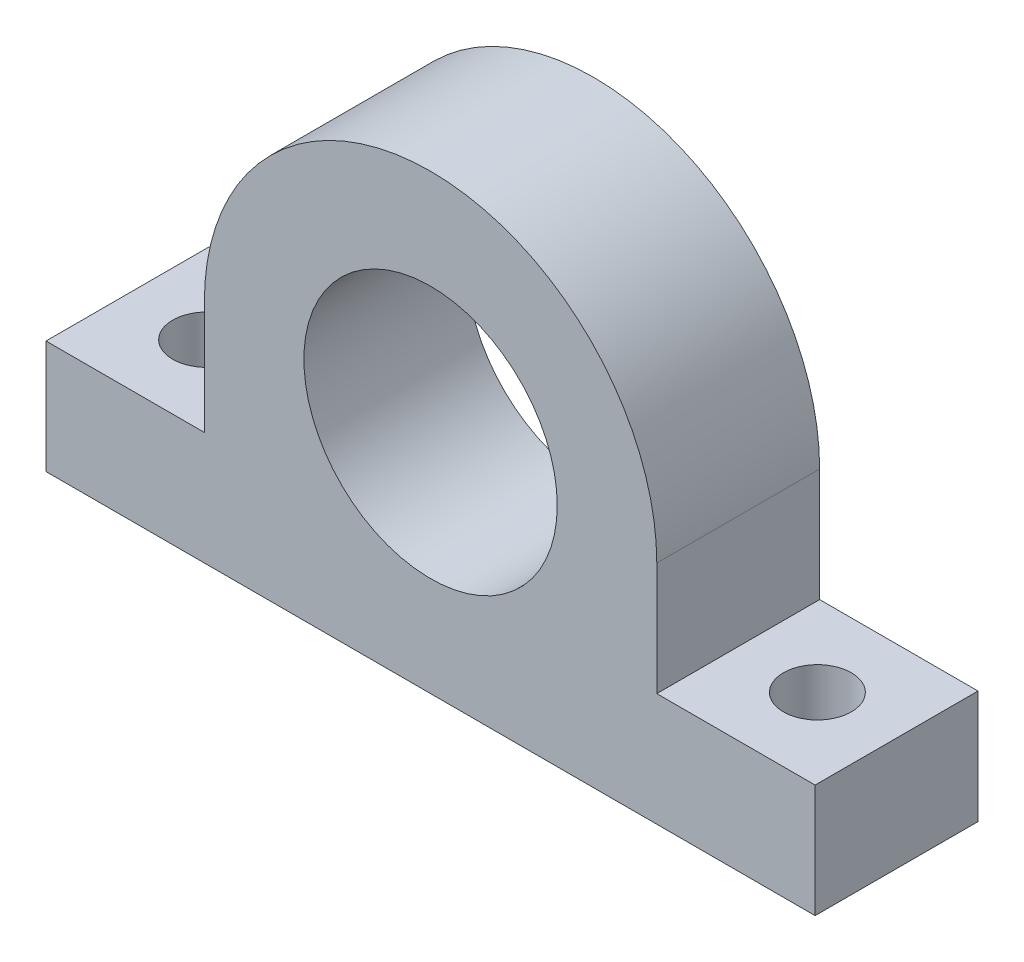
ISO-10303-21;
HEADER;
FILE_DESCRIPTION(('STEP AP214'),'2;1');
FILE_NAME('part.step','',(''),(''),'','','');
FILE_SCHEMA(('AUTOMOTIVE_DESIGN { 1 0 10303 214 1 1 1 1 }'));
ENDSEC;
DATA;
#1=APPLICATION_CONTEXT('core data for automotive mechanical design processes');
#2=APPLICATION_PROTOCOL_DEFINITION('international standard','automotive_design',2000,#1);
#3=PRODUCT_CONTEXT('',#1,'mechanical');
#4=PRODUCT('Part','Part','',(#3));
#5=PRODUCT_RELATED_PRODUCT_CATEGORY('part','',(#4));
#6=PRODUCT_DEFINITION_FORMATION('','',#4);
#7=PRODUCT_DEFINITION_CONTEXT('part definition',#1,'design');
#8=PRODUCT_DEFINITION('design','',#6,#7);
#9=PRODUCT_DEFINITION_SHAPE('','',#8);
#10=(LENGTH_UNIT() NAMED_UNIT(*) SI_UNIT(.MILLI.,.METRE.));
#11=(NAMED_UNIT(*) PLANE_ANGLE_UNIT() SI_UNIT($,.RADIAN.));
#12=(NAMED_UNIT(*) SI_UNIT($,.STERADIAN.) SOLID_ANGLE_UNIT());
#13=UNCERTAINTY_MEASURE_WITH_UNIT(LENGTH_MEASURE(1.E-05),#10,'distance_accuracy_value','');
#14=(GEOMETRIC_REPRESENTATION_CONTEXT(3) GLOBAL_UNCERTAINTY_ASSIGNED_CONTEXT((#13)) GLOBAL_UNIT_ASSIGNED_CONTEXT((#10,
#11,#12)) REPRESENTATION_CONTEXT('',''));
#15=CARTESIAN_POINT('',(0.,0.,0.));
#16=DIRECTION('',(0.,0.,1.));
#17=DIRECTION('',(1.,0.,0.));
#18=AXIS2_PLACEMENT_3D('',#15,#16,#17);
#19=CARTESIAN_POINT('',(0.,5.,7.2));
#20=DIRECTION('',(0.,0.,-1.));
#21=DIRECTION('',(-1.,0.,0.));
#22=AXIS2_PLACEMENT_3D('',#19,#20,#21);
#23=PLANE('',#22);
#24=DIRECTION('',(0.,1.,0.));
#25=VECTOR('',#24,1.);
#26=CARTESIAN_POINT('',(10.,5.,7.2));
#27=LINE('',#26,#25);
#28=CARTESIAN_POINT('',(10.,0.,7.2));
#29=VERTEX_POINT('',#28);
#30=CARTESIAN_POINT('',(10.,5.,7.2));
#31=VERTEX_POINT('',#30);
#32=EDGE_CURVE('E150',#29,#31,#27,.T.);
#33=ORIENTED_EDGE('',*,*,#32,.T.);
#34=CARTESIAN_POINT('',(0.,5.,7.2));
#35=DIRECTION('',(0.,0.,1.));
#36=DIRECTION('',(-1.,0.,0.));
#37=AXIS2_PLACEMENT_3D('',#34,#35,#36);
#38=CIRCLE('',#37,10.);
#39=CARTESIAN_POINT('',(-10.,5.,7.2));
#40=VERTEX_POINT('',#39);
#41=EDGE_CURVE('E98',#31,#40,#38,.T.);
#42=ORIENTED_EDGE('',*,*,#41,.T.);
#43=DIRECTION('',(0.,-1.,0.));
#44=VECTOR('',#43,1.);
#45=CARTESIAN_POINT('',(-10.,0.,7.2));
#46=LINE('',#45,#44);
#47=CARTESIAN_POINT('',(-10.,0.,7.2));
#48=VERTEX_POINT('',#47);
#49=EDGE_CURVE('E165',#40,#48,#46,.T.);
#50=ORIENTED_EDGE('',*,*,#49,.T.);
#51=DIRECTION('',(-1.,0.,0.));
#52=VECTOR('',#51,1.);
#53=CARTESIAN_POINT('',(-17.,0.,7.2));
#54=LINE('',#53,#52);
#55=CARTESIAN_POINT('',(-17.,0.,7.2));
#56=VERTEX_POINT('',#55);
#57=EDGE_CURVE('E178',#48,#56,#54,.T.);
#58=ORIENTED_EDGE('',*,*,#57,.T.);
#59=DIRECTION('',(0.,-1.,0.));
#60=VECTOR('',#59,1.);
#61=CARTESIAN_POINT('',(-17.,-5.,7.2));
#62=LINE('',#61,#60);
#63=CARTESIAN_POINT('',(-17.,-5.,7.2));
#64=VERTEX_POINT('',#63);
#65=EDGE_CURVE('E117',#56,#64,#62,.T.);
#66=ORIENTED_EDGE('',*,*,#65,.T.);
#67=DIRECTION('',(1.,0.,0.));
#68=VECTOR('',#67,1.);
#69=CARTESIAN_POINT('',(17.,-5.,7.2));
#70=LINE('',#69,#68);
#71=CARTESIAN_POINT('',(17.,-5.,7.2));
#72=VERTEX_POINT('',#71);
#73=EDGE_CURVE('E111',#64,#72,#70,.T.);
#74=ORIENTED_EDGE('',*,*,#73,.T.);
#75=DIRECTION('',(0.,1.,0.));
#76=VECTOR('',#75,1.);
#77=CARTESIAN_POINT('',(17.,0.,7.2));
#78=LINE('',#77,#76);
#79=CARTESIAN_POINT('',(17.,0.,7.2));
#80=VERTEX_POINT('',#79);
#81=EDGE_CURVE('E115',#72,#80,#78,.T.);
#82=ORIENTED_EDGE('',*,*,#81,.T.);
#83=DIRECTION('',(-1.,0.,0.));
#84=VECTOR('',#83,1.);
#85=CARTESIAN_POINT('',(10.,0.,7.2));
#86=LINE('',#85,#84);
#87=EDGE_CURVE('E55',#80,#29,#86,.T.);
#88=ORIENTED_EDGE('',*,*,#87,.T.);
#89=EDGE_LOOP('',(#33,#42,#50,#58,#66,#74,#82,#88));
#90=FACE_BOUND('',#89,.T.);
#91=CARTESIAN_POINT('',(0.,5.,7.2));
#92=DIRECTION('',(0.,0.,1.));
#93=DIRECTION('',(1.,0.,0.));
#94=AXIS2_PLACEMENT_3D('',#91,#92,#93);
#95=CIRCLE('',#94,5.6);
#96=CARTESIAN_POINT('',(5.6,5.,7.2));
#97=VERTEX_POINT('',#96);
#98=EDGE_CURVE('E139',#97,#97,#95,.T.);
#99=ORIENTED_EDGE('',*,*,#98,.F.);
#100=EDGE_LOOP('',(#99));
#101=FACE_BOUND('',#100,.T.);
#102=ADVANCED_FACE('F38',(#90,#101),#23,.F.);
#103=CARTESIAN_POINT('',(0.,5.,0.));
#104=DIRECTION('',(0.,0.,-1.));
#105=DIRECTION('',(-1.,0.,0.));
#106=AXIS2_PLACEMENT_3D('',#103,#104,#105);
#107=PLANE('',#106);
#108=DIRECTION('',(0.,1.,0.));
#109=VECTOR('',#108,1.);
#110=CARTESIAN_POINT('',(10.,5.,0.));
#111=LINE('',#110,#109);
#112=CARTESIAN_POINT('',(10.,0.,0.));
#113=VERTEX_POINT('',#112);
#114=CARTESIAN_POINT('',(10.,5.,0.));
#115=VERTEX_POINT('',#114);
#116=EDGE_CURVE('E135',#113,#115,#111,.T.);
#117=ORIENTED_EDGE('',*,*,#116,.F.);
#118=DIRECTION('',(-1.,0.,0.));
#119=VECTOR('',#118,1.);
#120=CARTESIAN_POINT('',(10.,0.,0.));
#121=LINE('',#120,#119);
#122=CARTESIAN_POINT('',(17.,0.,0.));
#123=VERTEX_POINT('',#122);
#124=EDGE_CURVE('E90',#123,#113,#121,.T.);
#125=ORIENTED_EDGE('',*,*,#124,.F.);
#126=DIRECTION('',(0.,1.,0.));
#127=VECTOR('',#126,1.);
#128=CARTESIAN_POINT('',(17.,0.,0.));
#129=LINE('',#128,#127);
#130=CARTESIAN_POINT('',(17.,-5.,0.));
#131=VERTEX_POINT('',#130);
#132=EDGE_CURVE('E84',#131,#123,#129,.T.);
#133=ORIENTED_EDGE('',*,*,#132,.F.);
#134=DIRECTION('',(1.,0.,0.));
#135=VECTOR('',#134,1.);
#136=CARTESIAN_POINT('',(17.,-5.,0.));
#137=LINE('',#136,#135);
#138=CARTESIAN_POINT('',(-17.,-5.,0.));
#139=VERTEX_POINT('',#138);
#140=EDGE_CURVE('E125',#139,#131,#137,.T.);
#141=ORIENTED_EDGE('',*,*,#140,.F.);
#142=DIRECTION('',(0.,-1.,0.));
#143=VECTOR('',#142,1.);
#144=CARTESIAN_POINT('',(-17.,-5.,0.));
#145=LINE('',#144,#143);
#146=CARTESIAN_POINT('',(-17.,0.,0.));
#147=VERTEX_POINT('',#146);
#148=EDGE_CURVE('E145',#147,#139,#145,.T.);
#149=ORIENTED_EDGE('',*,*,#148,.F.);
#150=DIRECTION('',(-1.,0.,0.));
#151=VECTOR('',#150,1.);
#152=CARTESIAN_POINT('',(-17.,0.,0.));
#153=LINE('',#152,#151);
#154=CARTESIAN_POINT('',(-10.,0.,0.));
#155=VERTEX_POINT('',#154);
#156=EDGE_CURVE('E143',#155,#147,#153,.T.);
#157=ORIENTED_EDGE('',*,*,#156,.F.);
#158=DIRECTION('',(0.,-1.,0.));
#159=VECTOR('',#158,1.);
#160=CARTESIAN_POINT('',(-10.,0.,0.));
#161=LINE('',#160,#159);
#162=CARTESIAN_POINT('',(-10.,5.,0.));
#163=VERTEX_POINT('',#162);
#164=EDGE_CURVE('E141',#163,#155,#161,.T.);
#165=ORIENTED_EDGE('',*,*,#164,.F.);
#166=CARTESIAN_POINT('',(0.,5.,0.));
#167=DIRECTION('',(0.,0.,1.));
#168=DIRECTION('',(-1.,0.,0.));
#169=AXIS2_PLACEMENT_3D('',#166,#167,#168);
#170=CIRCLE('',#169,10.);
#171=EDGE_CURVE('E138',#115,#163,#170,.T.);
#172=ORIENTED_EDGE('',*,*,#171,.F.);
#173=EDGE_LOOP('',(#117,#125,#133,#141,#149,#157,#165,#172));
#174=FACE_BOUND('',#173,.T.);
#175=CARTESIAN_POINT('',(0.,5.,0.));
#176=DIRECTION('',(0.,0.,1.));
#177=DIRECTION('',(1.,0.,0.));
#178=AXIS2_PLACEMENT_3D('',#175,#176,#177);
#179=CIRCLE('',#178,5.6);
#180=CARTESIAN_POINT('',(5.6,5.,0.));
#181=VERTEX_POINT('',#180);
#182=EDGE_CURVE('E184',#181,#181,#179,.T.);
#183=ORIENTED_EDGE('',*,*,#182,.T.);
#184=EDGE_LOOP('',(#183));
#185=FACE_BOUND('',#184,.T.);
#186=ADVANCED_FACE('F169',(#174,#185),#107,.T.);
#187=CARTESIAN_POINT('',(10.,5.,7.2));
#188=DIRECTION('',(-1.,0.,0.));
#189=DIRECTION('',(0.,-1.,0.));
#190=AXIS2_PLACEMENT_3D('',#187,#188,#189);
#191=PLANE('',#190);
#192=ORIENTED_EDGE('',*,*,#116,.T.);
#193=DIRECTION('',(0.,0.,-1.));
#194=VECTOR('',#193,1.);
#195=CARTESIAN_POINT('',(10.,5.,7.2));
#196=LINE('',#195,#194);
#197=EDGE_CURVE('E11',#31,#115,#196,.T.);
#198=ORIENTED_EDGE('',*,*,#197,.F.);
#199=ORIENTED_EDGE('',*,*,#32,.F.);
#200=DIRECTION('',(0.,0.,-1.));
#201=VECTOR('',#200,1.);
#202=CARTESIAN_POINT('',(10.,0.,7.2));
#203=LINE('',#202,#201);
#204=EDGE_CURVE('E131',#29,#113,#203,.T.);
#205=ORIENTED_EDGE('',*,*,#204,.T.);
#206=EDGE_LOOP('',(#192,#198,#199,#205));
#207=FACE_BOUND('',#206,.T.);
#208=ADVANCED_FACE('F40',(#207),#191,.F.);
#209=CARTESIAN_POINT('',(0.,5.,7.2));
#210=DIRECTION('',(0.,0.,-1.));
#211=DIRECTION('',(-1.,0.,0.));
#212=AXIS2_PLACEMENT_3D('',#209,#210,#211);
#213=CYLINDRICAL_SURFACE('',#212,10.);
#214=ORIENTED_EDGE('',*,*,#171,.T.);
#215=DIRECTION('',(0.,0.,-1.));
#216=VECTOR('',#215,1.);
#217=CARTESIAN_POINT('',(-10.,5.,7.2));
#218=LINE('',#217,#216);
#219=EDGE_CURVE('E47',#40,#163,#218,.T.);
#220=ORIENTED_EDGE('',*,*,#219,.F.);
#221=ORIENTED_EDGE('',*,*,#41,.F.);
#222=ORIENTED_EDGE('',*,*,#197,.T.);
#223=EDGE_LOOP('',(#214,#220,#221,#222));
#224=FACE_BOUND('',#223,.T.);
#225=ADVANCED_FACE('F244',(#224),#213,.T.);
#226=CARTESIAN_POINT('',(-10.,0.,7.2));
#227=DIRECTION('',(1.,0.,0.));
#228=DIRECTION('',(0.,0.,-1.));
#229=AXIS2_PLACEMENT_3D('',#226,#227,#228);
#230=PLANE('',#229);
#231=ORIENTED_EDGE('',*,*,#164,.T.);
#232=DIRECTION('',(0.,0.,-1.));
#233=VECTOR('',#232,1.);
#234=CARTESIAN_POINT('',(-10.,0.,7.2));
#235=LINE('',#234,#233);
#236=EDGE_CURVE('E157',#48,#155,#235,.T.);
#237=ORIENTED_EDGE('',*,*,#236,.F.);
#238=ORIENTED_EDGE('',*,*,#49,.F.);
#239=ORIENTED_EDGE('',*,*,#219,.T.);
#240=EDGE_LOOP('',(#231,#237,#238,#239));
#241=FACE_BOUND('',#240,.T.);
#242=ADVANCED_FACE('F163',(#241),#230,.F.);
#243=CARTESIAN_POINT('',(-17.,0.,7.2));
#244=DIRECTION('',(0.,-1.,0.));
#245=DIRECTION('',(1.,0.,0.));
#246=AXIS2_PLACEMENT_3D('',#243,#244,#245);
#247=PLANE('',#246);
#248=CARTESIAN_POINT('',(-13.5,0.,3.6));
#249=DIRECTION('',(0.,1.,0.));
#250=DIRECTION('',(1.,0.,0.));
#251=AXIS2_PLACEMENT_3D('',#248,#249,#250);
#252=CIRCLE('',#251,1.5);
#253=CARTESIAN_POINT('',(-12.,0.,3.6));
#254=VERTEX_POINT('',#253);
#255=EDGE_CURVE('E193',#254,#254,#252,.T.);
#256=ORIENTED_EDGE('',*,*,#255,.F.);
#257=EDGE_LOOP('',(#256));
#258=FACE_BOUND('',#257,.T.);
#259=ORIENTED_EDGE('',*,*,#156,.T.);
#260=DIRECTION('',(0.,0.,-1.));
#261=VECTOR('',#260,1.);
#262=CARTESIAN_POINT('',(-17.,0.,7.2));
#263=LINE('',#262,#261);
#264=EDGE_CURVE('E154',#56,#147,#263,.T.);
#265=ORIENTED_EDGE('',*,*,#264,.F.);
#266=ORIENTED_EDGE('',*,*,#57,.F.);
#267=ORIENTED_EDGE('',*,*,#236,.T.);
#268=EDGE_LOOP('',(#259,#265,#266,#267));
#269=FACE_BOUND('',#268,.T.);
#270=ADVANCED_FACE('F174',(#258,#269),#247,.F.);
#271=CARTESIAN_POINT('',(-17.,-5.,7.2));
#272=DIRECTION('',(1.,0.,0.));
#273=DIRECTION('',(0.,1.,0.));
#274=AXIS2_PLACEMENT_3D('',#271,#272,#273);
#275=PLANE('',#274);
#276=ORIENTED_EDGE('',*,*,#148,.T.);
#277=DIRECTION('',(0.,0.,-1.));
#278=VECTOR('',#277,1.);
#279=CARTESIAN_POINT('',(-17.,-5.,7.2));
#280=LINE('',#279,#278);
#281=EDGE_CURVE('E126',#64,#139,#280,.T.);
#282=ORIENTED_EDGE('',*,*,#281,.F.);
#283=ORIENTED_EDGE('',*,*,#65,.F.);
#284=ORIENTED_EDGE('',*,*,#264,.T.);
#285=EDGE_LOOP('',(#276,#282,#283,#284));
#286=FACE_BOUND('',#285,.T.);
#287=ADVANCED_FACE('F177',(#286),#275,.F.);
#288=CARTESIAN_POINT('',(17.,-5.,7.2));
#289=DIRECTION('',(0.,1.,0.));
#290=DIRECTION('',(-1.,0.,0.));
#291=AXIS2_PLACEMENT_3D('',#288,#289,#290);
#292=PLANE('',#291);
#293=CARTESIAN_POINT('',(13.5,-5.00000000000001,3.6));
#294=DIRECTION('',(0.,1.,0.));
#295=DIRECTION('',(-1.,0.,0.));
#296=AXIS2_PLACEMENT_3D('',#293,#294,#295);
#297=CIRCLE('',#296,1.5);
#298=CARTESIAN_POINT('',(12.,-5.00000000000001,3.6));
#299=VERTEX_POINT('',#298);
#300=EDGE_CURVE('E187',#299,#299,#297,.T.);
#301=ORIENTED_EDGE('',*,*,#300,.T.);
#302=EDGE_LOOP('',(#301));
#303=FACE_BOUND('',#302,.T.);
#304=CARTESIAN_POINT('',(-13.5,-5.00000000000001,3.6));
#305=DIRECTION('',(0.,1.,0.));
#306=DIRECTION('',(1.,0.,0.));
#307=AXIS2_PLACEMENT_3D('',#304,#305,#306);
#308=CIRCLE('',#307,1.5);
#309=CARTESIAN_POINT('',(-12.,-5.00000000000001,3.6));
#310=VERTEX_POINT('',#309);
#311=EDGE_CURVE('E190',#310,#310,#308,.T.);
#312=ORIENTED_EDGE('',*,*,#311,.T.);
#313=EDGE_LOOP('',(#312));
#314=FACE_BOUND('',#313,.T.);
#315=ORIENTED_EDGE('',*,*,#140,.T.);
#316=DIRECTION('',(0.,0.,-1.));
#317=VECTOR('',#316,1.);
#318=CARTESIAN_POINT('',(17.,-5.,7.2));
#319=LINE('',#318,#317);
#320=EDGE_CURVE('E122',#72,#131,#319,.T.);
#321=ORIENTED_EDGE('',*,*,#320,.F.);
#322=ORIENTED_EDGE('',*,*,#73,.F.);
#323=ORIENTED_EDGE('',*,*,#281,.T.);
#324=EDGE_LOOP('',(#315,#321,#322,#323));
#325=FACE_BOUND('',#324,.T.);
#326=ADVANCED_FACE('F123',(#303,#314,#325),#292,.F.);
#327=CARTESIAN_POINT('',(17.,0.,7.2));
#328=DIRECTION('',(-1.,0.,0.));
#329=DIRECTION('',(0.,0.,1.));
#330=AXIS2_PLACEMENT_3D('',#327,#328,#329);
#331=PLANE('',#330);
#332=ORIENTED_EDGE('',*,*,#132,.T.);
#333=DIRECTION('',(0.,0.,-1.));
#334=VECTOR('',#333,1.);
#335=CARTESIAN_POINT('',(17.,0.,7.2));
#336=LINE('',#335,#334);
#337=EDGE_CURVE('E127',#80,#123,#336,.T.);
#338=ORIENTED_EDGE('',*,*,#337,.F.);
#339=ORIENTED_EDGE('',*,*,#81,.F.);
#340=ORIENTED_EDGE('',*,*,#320,.T.);
#341=EDGE_LOOP('',(#332,#338,#339,#340));
#342=FACE_BOUND('',#341,.T.);
#343=ADVANCED_FACE('F129',(#342),#331,.F.);
#344=CARTESIAN_POINT('',(10.,0.,7.2));
#345=DIRECTION('',(0.,-1.,0.));
#346=DIRECTION('',(1.,0.,0.));
#347=AXIS2_PLACEMENT_3D('',#344,#345,#346);
#348=PLANE('',#347);
#349=CARTESIAN_POINT('',(13.5,0.,3.6));
#350=DIRECTION('',(0.,1.,0.));
#351=DIRECTION('',(-1.,0.,0.));
#352=AXIS2_PLACEMENT_3D('',#349,#350,#351);
#353=CIRCLE('',#352,1.5);
#354=CARTESIAN_POINT('',(12.,0.,3.6));
#355=VERTEX_POINT('',#354);
#356=EDGE_CURVE('E196',#355,#355,#353,.T.);
#357=ORIENTED_EDGE('',*,*,#356,.F.);
#358=EDGE_LOOP('',(#357));
#359=FACE_BOUND('',#358,.T.);
#360=ORIENTED_EDGE('',*,*,#124,.T.);
#361=ORIENTED_EDGE('',*,*,#204,.F.);
#362=ORIENTED_EDGE('',*,*,#87,.F.);
#363=ORIENTED_EDGE('',*,*,#337,.T.);
#364=EDGE_LOOP('',(#360,#361,#362,#363));
#365=FACE_BOUND('',#364,.T.);
#366=ADVANCED_FACE('F212',(#359,#365),#348,.F.);
#367=CARTESIAN_POINT('',(0.,5.,7.2));
#368=DIRECTION('',(0.,0.,-1.));
#369=DIRECTION('',(-1.,0.,0.));
#370=AXIS2_PLACEMENT_3D('',#367,#368,#369);
#371=CYLINDRICAL_SURFACE('',#370,5.6);
#372=ORIENTED_EDGE('',*,*,#98,.T.);
#373=EDGE_LOOP('',(#372));
#374=FACE_BOUND('',#373,.T.);
#375=ORIENTED_EDGE('',*,*,#182,.F.);
#376=EDGE_LOOP('',(#375));
#377=FACE_BOUND('',#376,.T.);
#378=ADVANCED_FACE('F208',(#374,#377),#371,.F.);
#379=CARTESIAN_POINT('',(13.5,-5.00000000000001,3.6));
#380=DIRECTION('',(0.,1.,0.));
#381=DIRECTION('',(-1.,0.,0.));
#382=AXIS2_PLACEMENT_3D('',#379,#380,#381);
#383=CYLINDRICAL_SURFACE('',#382,1.5);
#384=ORIENTED_EDGE('',*,*,#300,.F.);
#385=EDGE_LOOP('',(#384));
#386=FACE_BOUND('',#385,.T.);
#387=ORIENTED_EDGE('',*,*,#356,.T.);
#388=EDGE_LOOP('',(#387));
#389=FACE_BOUND('',#388,.T.);
#390=ADVANCED_FACE('F204',(#386,#389),#383,.F.);
#391=CARTESIAN_POINT('',(-13.5,-5.00000000000001,3.6));
#392=DIRECTION('',(0.,1.,0.));
#393=DIRECTION('',(-1.,0.,0.));
#394=AXIS2_PLACEMENT_3D('',#391,#392,#393);
#395=CYLINDRICAL_SURFACE('',#394,1.5);
#396=ORIENTED_EDGE('',*,*,#311,.F.);
#397=EDGE_LOOP('',(#396));
#398=FACE_BOUND('',#397,.T.);
#399=ORIENTED_EDGE('',*,*,#255,.T.);
#400=EDGE_LOOP('',(#399));
#401=FACE_BOUND('',#400,.T.);
#402=ADVANCED_FACE('F207',(#398,#401),#395,.F.);
#403=CLOSED_SHELL('',(#102,#186,#208,#225,#242,#270,#287,#326,#343,#366,#378,#390,#402));
#404=MANIFOLD_SOLID_BREP('B2',#403);
#405=ADVANCED_BREP_SHAPE_REPRESENTATION('',(#18,#404),#14);
#406=SHAPE_DEFINITION_REPRESENTATION(#9,#405);
ENDSEC;
END-ISO-10303-21;
